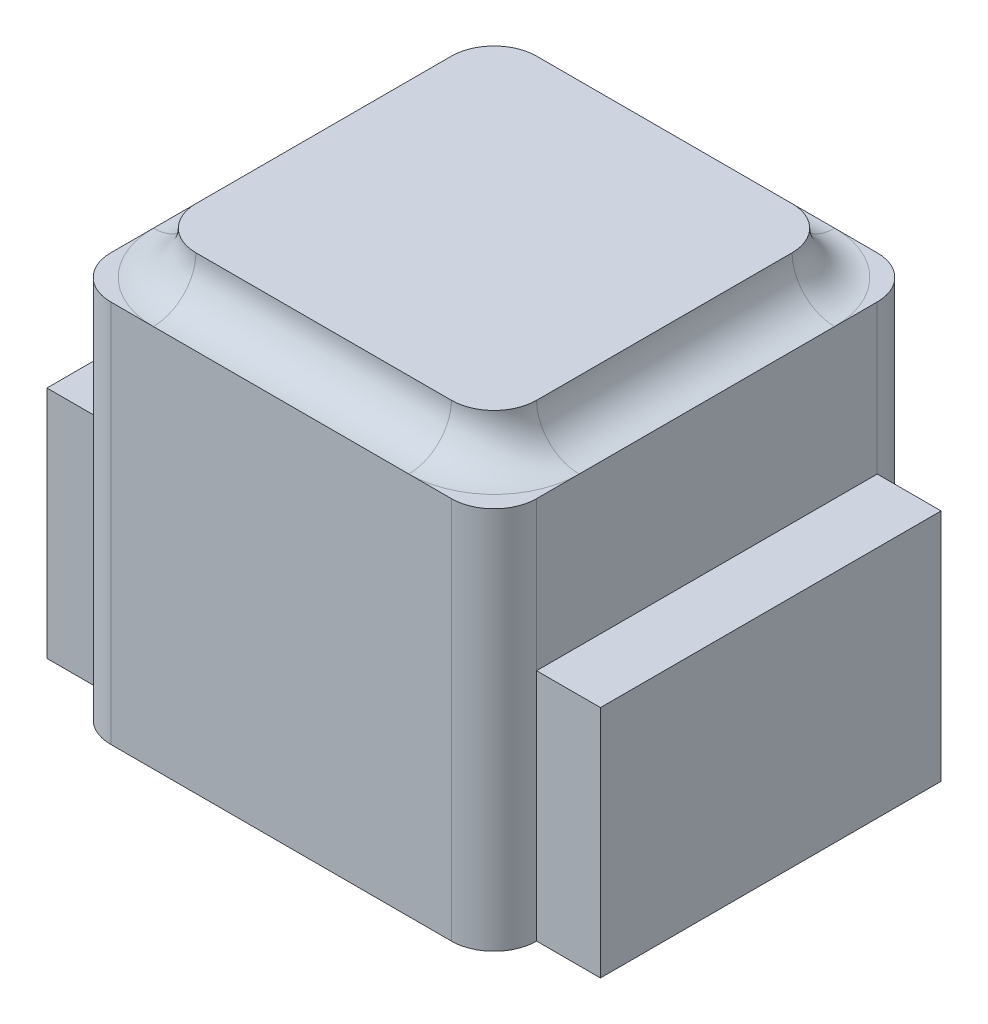
ISO-10303-21;
HEADER;
FILE_DESCRIPTION(('STEP AP214'),'2;1');
FILE_NAME('part.step','',(''),(''),'','','');
FILE_SCHEMA(('AUTOMOTIVE_DESIGN { 1 0 10303 214 1 1 1 1 }'));
ENDSEC;
DATA;
#1=APPLICATION_CONTEXT('core data for automotive mechanical design processes');
#2=APPLICATION_PROTOCOL_DEFINITION('international standard','automotive_design',2000,#1);
#3=PRODUCT_CONTEXT('',#1,'mechanical');
#4=PRODUCT('Part','Part','',(#3));
#5=PRODUCT_RELATED_PRODUCT_CATEGORY('part','',(#4));
#6=PRODUCT_DEFINITION_FORMATION('','',#4);
#7=PRODUCT_DEFINITION_CONTEXT('part definition',#1,'design');
#8=PRODUCT_DEFINITION('design','',#6,#7);
#9=PRODUCT_DEFINITION_SHAPE('','',#8);
#10=(LENGTH_UNIT() NAMED_UNIT(*) SI_UNIT(.MILLI.,.METRE.));
#11=(NAMED_UNIT(*) PLANE_ANGLE_UNIT() SI_UNIT($,.RADIAN.));
#12=(NAMED_UNIT(*) SI_UNIT($,.STERADIAN.) SOLID_ANGLE_UNIT());
#13=UNCERTAINTY_MEASURE_WITH_UNIT(LENGTH_MEASURE(1.E-05),#10,'distance_accuracy_value','');
#14=(GEOMETRIC_REPRESENTATION_CONTEXT(3) GLOBAL_UNCERTAINTY_ASSIGNED_CONTEXT((#13)) GLOBAL_UNIT_ASSIGNED_CONTEXT((#10,
#11,#12)) REPRESENTATION_CONTEXT('',''));
#15=CARTESIAN_POINT('',(0.,0.,0.));
#16=DIRECTION('',(0.,0.,1.));
#17=DIRECTION('',(1.,0.,0.));
#18=AXIS2_PLACEMENT_3D('',#15,#16,#17);
#19=CARTESIAN_POINT('',(0.,9.,0.));
#20=DIRECTION('',(0.,-1.,0.));
#21=DIRECTION('',(0.,0.,-1.));
#22=AXIS2_PLACEMENT_3D('',#19,#20,#21);
#23=PLANE('',#22);
#24=CARTESIAN_POINT('',(3.,9.,3.));
#25=DIRECTION('',(0.,-1.,0.));
#26=DIRECTION('',(0.,0.,-1.));
#27=AXIS2_PLACEMENT_3D('',#24,#25,#26);
#28=CIRCLE('',#27,2.);
#29=CARTESIAN_POINT('',(3.,9.,5.));
#30=VERTEX_POINT('',#29);
#31=CARTESIAN_POINT('',(5.,9.,3.));
#32=VERTEX_POINT('',#31);
#33=EDGE_CURVE('E11',#30,#32,#28,.F.);
#34=ORIENTED_EDGE('',*,*,#33,.F.);
#35=DIRECTION('',(1.,0.,0.));
#36=VECTOR('',#35,1.);
#37=CARTESIAN_POINT('',(5.,9.,5.));
#38=LINE('',#37,#36);
#39=CARTESIAN_POINT('',(3.99999999999999,9.,5.));
#40=VERTEX_POINT('',#39);
#41=EDGE_CURVE('E279',#30,#40,#38,.T.);
#42=ORIENTED_EDGE('',*,*,#41,.T.);
#43=CARTESIAN_POINT('',(4.,9.,4.));
#44=DIRECTION('',(0.,-1.,0.));
#45=DIRECTION('',(0.,0.,-1.));
#46=AXIS2_PLACEMENT_3D('',#43,#44,#45);
#47=CIRCLE('',#46,1.);
#48=CARTESIAN_POINT('',(5.,9.,4.));
#49=VERTEX_POINT('',#48);
#50=EDGE_CURVE('E306',#49,#40,#47,.T.);
#51=ORIENTED_EDGE('',*,*,#50,.F.);
#52=DIRECTION('',(0.,0.,-1.));
#53=VECTOR('',#52,1.);
#54=CARTESIAN_POINT('',(5.,9.,-5.));
#55=LINE('',#54,#53);
#56=EDGE_CURVE('E364',#49,#32,#55,.T.);
#57=ORIENTED_EDGE('',*,*,#56,.T.);
#58=EDGE_LOOP('',(#34,#42,#51,#57));
#59=FACE_BOUND('',#58,.T.);
#60=ADVANCED_FACE('F33',(#59),#23,.F.);
#61=CARTESIAN_POINT('',(-3.,9.,3.));
#62=DIRECTION('',(0.,-1.,0.));
#63=DIRECTION('',(0.,0.,-1.));
#64=AXIS2_PLACEMENT_3D('',#61,#62,#63);
#65=CIRCLE('',#64,2.);
#66=CARTESIAN_POINT('',(-5.,9.,3.));
#67=VERTEX_POINT('',#66);
#68=CARTESIAN_POINT('',(-3.,9.,5.));
#69=VERTEX_POINT('',#68);
#70=EDGE_CURVE('E42',#67,#69,#65,.F.);
#71=ORIENTED_EDGE('',*,*,#70,.F.);
#72=DIRECTION('',(0.,0.,1.));
#73=VECTOR('',#72,1.);
#74=CARTESIAN_POINT('',(-5.,9.,-5.));
#75=LINE('',#74,#73);
#76=CARTESIAN_POINT('',(-5.,9.,4.));
#77=VERTEX_POINT('',#76);
#78=EDGE_CURVE('E261',#67,#77,#75,.T.);
#79=ORIENTED_EDGE('',*,*,#78,.T.);
#80=CARTESIAN_POINT('',(-4.,9.,4.));
#81=DIRECTION('',(0.,-1.,0.));
#82=DIRECTION('',(0.,0.,-1.));
#83=AXIS2_PLACEMENT_3D('',#80,#81,#82);
#84=CIRCLE('',#83,1.);
#85=CARTESIAN_POINT('',(-3.99999999999999,9.,5.));
#86=VERTEX_POINT('',#85);
#87=EDGE_CURVE('E255',#86,#77,#84,.T.);
#88=ORIENTED_EDGE('',*,*,#87,.F.);
#89=EDGE_CURVE('E258',#86,#69,#38,.T.);
#90=ORIENTED_EDGE('',*,*,#89,.T.);
#91=EDGE_LOOP('',(#71,#79,#88,#90));
#92=FACE_BOUND('',#91,.T.);
#93=ADVANCED_FACE('F257',(#92),#23,.F.);
#94=CARTESIAN_POINT('',(-3.,9.,-3.));
#95=DIRECTION('',(0.,-1.,0.));
#96=DIRECTION('',(0.,0.,-1.));
#97=AXIS2_PLACEMENT_3D('',#94,#95,#96);
#98=CIRCLE('',#97,2.);
#99=CARTESIAN_POINT('',(-3.,9.,-5.));
#100=VERTEX_POINT('',#99);
#101=CARTESIAN_POINT('',(-5.,9.,-3.));
#102=VERTEX_POINT('',#101);
#103=EDGE_CURVE('E319',#100,#102,#98,.F.);
#104=ORIENTED_EDGE('',*,*,#103,.F.);
#105=DIRECTION('',(-1.,0.,0.));
#106=VECTOR('',#105,1.);
#107=CARTESIAN_POINT('',(5.,9.,-5.));
#108=LINE('',#107,#106);
#109=CARTESIAN_POINT('',(-4.,9.,-5.));
#110=VERTEX_POINT('',#109);
#111=EDGE_CURVE('E367',#100,#110,#108,.T.);
#112=ORIENTED_EDGE('',*,*,#111,.T.);
#113=CARTESIAN_POINT('',(-4.,9.,-4.));
#114=DIRECTION('',(0.,-1.,0.));
#115=DIRECTION('',(0.,0.,-1.));
#116=AXIS2_PLACEMENT_3D('',#113,#114,#115);
#117=CIRCLE('',#116,1.);
#118=CARTESIAN_POINT('',(-5.,9.,-4.));
#119=VERTEX_POINT('',#118);
#120=EDGE_CURVE('E265',#119,#110,#117,.T.);
#121=ORIENTED_EDGE('',*,*,#120,.F.);
#122=EDGE_CURVE('E360',#119,#102,#75,.T.);
#123=ORIENTED_EDGE('',*,*,#122,.T.);
#124=EDGE_LOOP('',(#104,#112,#121,#123));
#125=FACE_BOUND('',#124,.T.);
#126=ADVANCED_FACE('F612',(#125),#23,.F.);
#127=CARTESIAN_POINT('',(3.,9.,-3.));
#128=DIRECTION('',(0.,-1.,0.));
#129=DIRECTION('',(0.,0.,-1.));
#130=AXIS2_PLACEMENT_3D('',#127,#128,#129);
#131=CIRCLE('',#130,2.);
#132=CARTESIAN_POINT('',(5.,9.,-3.));
#133=VERTEX_POINT('',#132);
#134=CARTESIAN_POINT('',(3.,9.,-5.));
#135=VERTEX_POINT('',#134);
#136=EDGE_CURVE('E50',#133,#135,#131,.F.);
#137=ORIENTED_EDGE('',*,*,#136,.F.);
#138=CARTESIAN_POINT('',(5.,9.,-4.));
#139=VERTEX_POINT('',#138);
#140=EDGE_CURVE('E277',#133,#139,#55,.T.);
#141=ORIENTED_EDGE('',*,*,#140,.T.);
#142=CARTESIAN_POINT('',(4.,9.,-4.));
#143=DIRECTION('',(0.,-1.,0.));
#144=DIRECTION('',(0.,0.,-1.));
#145=AXIS2_PLACEMENT_3D('',#142,#143,#144);
#146=CIRCLE('',#145,1.);
#147=CARTESIAN_POINT('',(3.99999999999999,9.,-5.));
#148=VERTEX_POINT('',#147);
#149=EDGE_CURVE('E373',#148,#139,#146,.T.);
#150=ORIENTED_EDGE('',*,*,#149,.F.);
#151=EDGE_CURVE('E266',#148,#135,#108,.T.);
#152=ORIENTED_EDGE('',*,*,#151,.T.);
#153=EDGE_LOOP('',(#137,#141,#150,#152));
#154=FACE_BOUND('',#153,.T.);
#155=ADVANCED_FACE('F582',(#154),#23,.F.);
#156=CARTESIAN_POINT('',(3.5,8.,-3.5));
#157=DIRECTION('',(1.,0.,0.));
#158=DIRECTION('',(0.,0.,-1.));
#159=AXIS2_PLACEMENT_3D('',#156,#157,#158);
#160=PLANE('',#159);
#161=DIRECTION('',(0.,-1.,0.));
#162=VECTOR('',#161,1.);
#163=CARTESIAN_POINT('',(3.5,0.,0.5));
#164=LINE('',#163,#162);
#165=CARTESIAN_POINT('',(3.5,2.,0.5));
#166=VERTEX_POINT('',#165);
#167=CARTESIAN_POINT('',(3.5,0.,0.499999999999999));
#168=VERTEX_POINT('',#167);
#169=EDGE_CURVE('E377',#166,#168,#164,.T.);
#170=ORIENTED_EDGE('',*,*,#169,.T.);
#171=DIRECTION('',(0.,0.,1.));
#172=VECTOR('',#171,1.);
#173=CARTESIAN_POINT('',(3.5,0.,-3.5));
#174=LINE('',#173,#172);
#175=CARTESIAN_POINT('',(3.5,0.,3.5));
#176=VERTEX_POINT('',#175);
#177=EDGE_CURVE('E421',#168,#176,#174,.T.);
#178=ORIENTED_EDGE('',*,*,#177,.T.);
#179=DIRECTION('',(0.,-1.,0.));
#180=VECTOR('',#179,1.);
#181=CARTESIAN_POINT('',(3.5,8.,3.5));
#182=LINE('',#181,#180);
#183=CARTESIAN_POINT('',(3.5,8.,3.5));
#184=VERTEX_POINT('',#183);
#185=EDGE_CURVE('E438',#184,#176,#182,.T.);
#186=ORIENTED_EDGE('',*,*,#185,.F.);
#187=DIRECTION('',(0.,0.,1.));
#188=VECTOR('',#187,1.);
#189=CARTESIAN_POINT('',(3.5,8.,-3.5));
#190=LINE('',#189,#188);
#191=CARTESIAN_POINT('',(3.5,8.,-3.5));
#192=VERTEX_POINT('',#191);
#193=EDGE_CURVE('E425',#192,#184,#190,.T.);
#194=ORIENTED_EDGE('',*,*,#193,.F.);
#195=DIRECTION('',(0.,-1.,0.));
#196=VECTOR('',#195,1.);
#197=CARTESIAN_POINT('',(3.5,8.,-3.5));
#198=LINE('',#197,#196);
#199=CARTESIAN_POINT('',(3.5,0.,-3.5));
#200=VERTEX_POINT('',#199);
#201=EDGE_CURVE('E449',#192,#200,#198,.T.);
#202=ORIENTED_EDGE('',*,*,#201,.T.);
#203=CARTESIAN_POINT('',(3.5,0.,-0.5));
#204=VERTEX_POINT('',#203);
#205=EDGE_CURVE('E439',#200,#204,#174,.T.);
#206=ORIENTED_EDGE('',*,*,#205,.T.);
#207=DIRECTION('',(0.,1.,0.));
#208=VECTOR('',#207,1.);
#209=CARTESIAN_POINT('',(3.5,0.,-0.5));
#210=LINE('',#209,#208);
#211=CARTESIAN_POINT('',(3.5,2.,-0.499999999999999));
#212=VERTEX_POINT('',#211);
#213=EDGE_CURVE('E379',#204,#212,#210,.T.);
#214=ORIENTED_EDGE('',*,*,#213,.T.);
#215=DIRECTION('',(0.,0.,1.));
#216=VECTOR('',#215,1.);
#217=CARTESIAN_POINT('',(3.5,2.,-0.499999999999999));
#218=LINE('',#217,#216);
#219=EDGE_CURVE('E382',#212,#166,#218,.T.);
#220=ORIENTED_EDGE('',*,*,#219,.T.);
#221=EDGE_LOOP('',(#170,#178,#186,#194,#202,#206,#214,#220));
#222=FACE_BOUND('',#221,.T.);
#223=ADVANCED_FACE('F619',(#222),#160,.F.);
#224=CARTESIAN_POINT('',(-3.5,8.,-3.5));
#225=DIRECTION('',(-1.,0.,0.));
#226=DIRECTION('',(0.,0.,1.));
#227=AXIS2_PLACEMENT_3D('',#224,#225,#226);
#228=PLANE('',#227);
#229=DIRECTION('',(0.,-1.,0.));
#230=VECTOR('',#229,1.);
#231=CARTESIAN_POINT('',(-3.5,0.,0.5));
#232=LINE('',#231,#230);
#233=CARTESIAN_POINT('',(-3.5,2.,0.5));
#234=VERTEX_POINT('',#233);
#235=CARTESIAN_POINT('',(-3.5,0.,0.499999999999999));
#236=VERTEX_POINT('',#235);
#237=EDGE_CURVE('E376',#234,#236,#232,.T.);
#238=ORIENTED_EDGE('',*,*,#237,.F.);
#239=DIRECTION('',(0.,0.,1.));
#240=VECTOR('',#239,1.);
#241=CARTESIAN_POINT('',(-3.5,2.,-0.499999999999999));
#242=LINE('',#241,#240);
#243=CARTESIAN_POINT('',(-3.5,2.,-0.499999999999999));
#244=VERTEX_POINT('',#243);
#245=EDGE_CURVE('E380',#244,#234,#242,.T.);
#246=ORIENTED_EDGE('',*,*,#245,.F.);
#247=DIRECTION('',(0.,1.,0.));
#248=VECTOR('',#247,1.);
#249=CARTESIAN_POINT('',(-3.5,0.,-0.5));
#250=LINE('',#249,#248);
#251=CARTESIAN_POINT('',(-3.5,0.,-0.5));
#252=VERTEX_POINT('',#251);
#253=EDGE_CURVE('E387',#252,#244,#250,.T.);
#254=ORIENTED_EDGE('',*,*,#253,.F.);
#255=DIRECTION('',(0.,0.,-1.));
#256=VECTOR('',#255,1.);
#257=CARTESIAN_POINT('',(-3.5,0.,-3.5));
#258=LINE('',#257,#256);
#259=CARTESIAN_POINT('',(-3.5,0.,-3.5));
#260=VERTEX_POINT('',#259);
#261=EDGE_CURVE('E444',#252,#260,#258,.T.);
#262=ORIENTED_EDGE('',*,*,#261,.T.);
#263=DIRECTION('',(0.,-1.,0.));
#264=VECTOR('',#263,1.);
#265=CARTESIAN_POINT('',(-3.5,8.,-3.5));
#266=LINE('',#265,#264);
#267=CARTESIAN_POINT('',(-3.5,8.,-3.5));
#268=VERTEX_POINT('',#267);
#269=EDGE_CURVE('E452',#268,#260,#266,.T.);
#270=ORIENTED_EDGE('',*,*,#269,.F.);
#271=DIRECTION('',(0.,0.,-1.));
#272=VECTOR('',#271,1.);
#273=CARTESIAN_POINT('',(-3.5,8.,-3.5));
#274=LINE('',#273,#272);
#275=CARTESIAN_POINT('',(-3.5,8.,3.5));
#276=VERTEX_POINT('',#275);
#277=EDGE_CURVE('E432',#276,#268,#274,.T.);
#278=ORIENTED_EDGE('',*,*,#277,.F.);
#279=DIRECTION('',(0.,-1.,0.));
#280=VECTOR('',#279,1.);
#281=CARTESIAN_POINT('',(-3.5,8.,3.5));
#282=LINE('',#281,#280);
#283=CARTESIAN_POINT('',(-3.5,0.,3.5));
#284=VERTEX_POINT('',#283);
#285=EDGE_CURVE('E455',#276,#284,#282,.T.);
#286=ORIENTED_EDGE('',*,*,#285,.T.);
#287=EDGE_CURVE('E445',#284,#236,#258,.T.);
#288=ORIENTED_EDGE('',*,*,#287,.T.);
#289=EDGE_LOOP('',(#238,#246,#254,#262,#270,#278,#286,#288));
#290=FACE_BOUND('',#289,.T.);
#291=ADVANCED_FACE('F771',(#290),#228,.F.);
#292=CARTESIAN_POINT('',(0.,8.,0.));
#293=DIRECTION('',(0.,-1.,0.));
#294=DIRECTION('',(0.,0.,-1.));
#295=AXIS2_PLACEMENT_3D('',#292,#293,#294);
#296=CYLINDRICAL_SURFACE('',#295,1.75);
#297=CARTESIAN_POINT('',(0.,8.,0.));
#298=DIRECTION('',(0.,-1.,0.));
#299=DIRECTION('',(0.,0.,-1.));
#300=AXIS2_PLACEMENT_3D('',#297,#298,#299);
#301=CIRCLE('',#300,1.75);
#302=CARTESIAN_POINT('',(0.,8.,-1.75));
#303=VERTEX_POINT('',#302);
#304=EDGE_CURVE('E418',#303,#303,#301,.T.);
#305=ORIENTED_EDGE('',*,*,#304,.T.);
#306=EDGE_LOOP('',(#305));
#307=FACE_BOUND('',#306,.T.);
#308=CARTESIAN_POINT('',(0.,2.,0.));
#309=DIRECTION('',(0.,-1.,0.));
#310=DIRECTION('',(0.,0.,-1.));
#311=AXIS2_PLACEMENT_3D('',#308,#309,#310);
#312=CIRCLE('',#311,1.75);
#313=CARTESIAN_POINT('',(-1.67705098312484,2.,-0.499999999999999));
#314=VERTEX_POINT('',#313);
#315=CARTESIAN_POINT('',(-1.67705098312484,2.,0.5));
#316=VERTEX_POINT('',#315);
#317=EDGE_CURVE('E305',#314,#316,#312,.F.);
#318=ORIENTED_EDGE('',*,*,#317,.T.);
#319=DIRECTION('',(0.,-1.,0.));
#320=VECTOR('',#319,1.);
#321=CARTESIAN_POINT('',(-1.67705098312484,8.,0.5));
#322=LINE('',#321,#320);
#323=CARTESIAN_POINT('',(-1.67705098312484,0.,0.5));
#324=VERTEX_POINT('',#323);
#325=EDGE_CURVE('E411',#316,#324,#322,.T.);
#326=ORIENTED_EDGE('',*,*,#325,.T.);
#327=CARTESIAN_POINT('',(0.,0.,0.));
#328=DIRECTION('',(0.,-1.,0.));
#329=DIRECTION('',(0.,0.,-1.));
#330=AXIS2_PLACEMENT_3D('',#327,#328,#329);
#331=CIRCLE('',#330,1.75);
#332=CARTESIAN_POINT('',(1.67705098312484,0.,0.5));
#333=VERTEX_POINT('',#332);
#334=EDGE_CURVE('E422',#333,#324,#331,.T.);
#335=ORIENTED_EDGE('',*,*,#334,.F.);
#336=DIRECTION('',(0.,-1.,0.));
#337=VECTOR('',#336,1.);
#338=CARTESIAN_POINT('',(1.67705098312484,8.,0.5));
#339=LINE('',#338,#337);
#340=CARTESIAN_POINT('',(1.67705098312484,2.,0.5));
#341=VERTEX_POINT('',#340);
#342=EDGE_CURVE('E414',#333,#341,#339,.F.);
#343=ORIENTED_EDGE('',*,*,#342,.T.);
#344=CARTESIAN_POINT('',(1.67705098312484,2.,-0.499999999999999));
#345=VERTEX_POINT('',#344);
#346=EDGE_CURVE('E302',#341,#345,#312,.F.);
#347=ORIENTED_EDGE('',*,*,#346,.T.);
#348=DIRECTION('',(0.,-1.,0.));
#349=VECTOR('',#348,1.);
#350=CARTESIAN_POINT('',(1.67705098312484,8.,-0.499999999999995));
#351=LINE('',#350,#349);
#352=CARTESIAN_POINT('',(1.67705098312484,0.,-0.5));
#353=VERTEX_POINT('',#352);
#354=EDGE_CURVE('E405',#345,#353,#351,.T.);
#355=ORIENTED_EDGE('',*,*,#354,.T.);
#356=CARTESIAN_POINT('',(-1.67705098312484,0.,-0.5));
#357=VERTEX_POINT('',#356);
#358=EDGE_CURVE('E417',#357,#353,#331,.T.);
#359=ORIENTED_EDGE('',*,*,#358,.F.);
#360=DIRECTION('',(0.,-1.,0.));
#361=VECTOR('',#360,1.);
#362=CARTESIAN_POINT('',(-1.67705098312484,8.,-0.499999999999995));
#363=LINE('',#362,#361);
#364=EDGE_CURVE('E408',#357,#314,#363,.F.);
#365=ORIENTED_EDGE('',*,*,#364,.T.);
#366=EDGE_LOOP('',(#318,#326,#335,#343,#347,#355,#359,#365));
#367=FACE_BOUND('',#366,.T.);
#368=ADVANCED_FACE('F652',(#307,#367),#296,.T.);
#369=CARTESIAN_POINT('',(-5.,10.,3.99999999999999));
#370=DIRECTION('',(1.,0.,0.));
#371=DIRECTION('',(0.,0.,-1.));
#372=AXIS2_PLACEMENT_3D('',#369,#370,#371);
#373=PLANE('',#372);
#374=DIRECTION('',(0.,-1.,0.));
#375=VECTOR('',#374,1.);
#376=CARTESIAN_POINT('',(-5.,10.,3.99999999999999));
#377=LINE('',#376,#375);
#378=CARTESIAN_POINT('',(-5.,5.5,4.));
#379=VERTEX_POINT('',#378);
#380=EDGE_CURVE('E285',#77,#379,#377,.T.);
#381=ORIENTED_EDGE('',*,*,#380,.F.);
#382=ORIENTED_EDGE('',*,*,#78,.F.);
#383=EDGE_CURVE('E362',#102,#67,#75,.T.);
#384=ORIENTED_EDGE('',*,*,#383,.F.);
#385=ORIENTED_EDGE('',*,*,#122,.F.);
#386=DIRECTION('',(0.,-1.,0.));
#387=VECTOR('',#386,1.);
#388=CARTESIAN_POINT('',(-5.,10.,-3.99999999999999));
#389=LINE('',#388,#387);
#390=CARTESIAN_POINT('',(-5.,5.5,-4.));
#391=VERTEX_POINT('',#390);
#392=EDGE_CURVE('E288',#119,#391,#389,.T.);
#393=ORIENTED_EDGE('',*,*,#392,.T.);
#394=DIRECTION('',(0.,0.,-1.));
#395=VECTOR('',#394,1.);
#396=CARTESIAN_POINT('',(-5.,5.5,3.99999999999999));
#397=LINE('',#396,#395);
#398=EDGE_CURVE('E506',#379,#391,#397,.T.);
#399=ORIENTED_EDGE('',*,*,#398,.F.);
#400=EDGE_LOOP('',(#381,#382,#384,#385,#393,#399));
#401=FACE_BOUND('',#400,.T.);
#402=ADVANCED_FACE('F590',(#401),#373,.F.);
#403=CARTESIAN_POINT('',(5.,10.,3.99999999999999));
#404=DIRECTION('',(-1.,0.,0.));
#405=DIRECTION('',(0.,0.,1.));
#406=AXIS2_PLACEMENT_3D('',#403,#404,#405);
#407=PLANE('',#406);
#408=DIRECTION('',(0.,-1.,0.));
#409=VECTOR('',#408,1.);
#410=CARTESIAN_POINT('',(5.,10.,-3.99999999999999));
#411=LINE('',#410,#409);
#412=CARTESIAN_POINT('',(5.,5.5,-3.99999999999999));
#413=VERTEX_POINT('',#412);
#414=EDGE_CURVE('E523',#139,#413,#411,.T.);
#415=ORIENTED_EDGE('',*,*,#414,.F.);
#416=ORIENTED_EDGE('',*,*,#140,.F.);
#417=EDGE_CURVE('E368',#32,#133,#55,.T.);
#418=ORIENTED_EDGE('',*,*,#417,.F.);
#419=ORIENTED_EDGE('',*,*,#56,.F.);
#420=DIRECTION('',(0.,-1.,0.));
#421=VECTOR('',#420,1.);
#422=CARTESIAN_POINT('',(5.,10.,3.99999999999999));
#423=LINE('',#422,#421);
#424=CARTESIAN_POINT('',(5.,5.5,3.99999999999999));
#425=VERTEX_POINT('',#424);
#426=EDGE_CURVE('E290',#49,#425,#423,.T.);
#427=ORIENTED_EDGE('',*,*,#426,.T.);
#428=DIRECTION('',(0.,0.,1.));
#429=VECTOR('',#428,1.);
#430=CARTESIAN_POINT('',(5.,5.5,3.99999999999999));
#431=LINE('',#430,#429);
#432=EDGE_CURVE('E299',#413,#425,#431,.T.);
#433=ORIENTED_EDGE('',*,*,#432,.F.);
#434=EDGE_LOOP('',(#415,#416,#418,#419,#427,#433));
#435=FACE_BOUND('',#434,.T.);
#436=ADVANCED_FACE('F530',(#435),#407,.F.);
#437=CARTESIAN_POINT('',(4.,10.,-4.));
#438=DIRECTION('',(0.,-1.,0.));
#439=DIRECTION('',(0.,0.,-1.));
#440=AXIS2_PLACEMENT_3D('',#437,#438,#439);
#441=CYLINDRICAL_SURFACE('',#440,1.);
#442=DIRECTION('',(0.,-1.,0.));
#443=VECTOR('',#442,1.);
#444=CARTESIAN_POINT('',(3.99999999999999,10.,-5.));
#445=LINE('',#444,#443);
#446=CARTESIAN_POINT('',(3.99999999999999,0.,-5.));
#447=VERTEX_POINT('',#446);
#448=EDGE_CURVE('E297',#148,#447,#445,.T.);
#449=ORIENTED_EDGE('',*,*,#448,.F.);
#450=ORIENTED_EDGE('',*,*,#149,.T.);
#451=ORIENTED_EDGE('',*,*,#414,.T.);
#452=DIRECTION('',(0.,1.,0.));
#453=VECTOR('',#452,1.);
#454=CARTESIAN_POINT('',(5.,10.,-4.));
#455=LINE('',#454,#453);
#456=CARTESIAN_POINT('',(5.,0.,-4.));
#457=VERTEX_POINT('',#456);
#458=EDGE_CURVE('E501',#457,#413,#455,.T.);
#459=ORIENTED_EDGE('',*,*,#458,.F.);
#460=CARTESIAN_POINT('',(4.,0.,-4.));
#461=DIRECTION('',(0.,1.,0.));
#462=DIRECTION('',(0.,0.,-1.));
#463=AXIS2_PLACEMENT_3D('',#460,#461,#462);
#464=CIRCLE('',#463,1.);
#465=EDGE_CURVE('E509',#457,#447,#464,.T.);
#466=ORIENTED_EDGE('',*,*,#465,.T.);
#467=EDGE_LOOP('',(#449,#450,#451,#459,#466));
#468=FACE_BOUND('',#467,.T.);
#469=ADVANCED_FACE('F552',(#468),#441,.T.);
#470=CARTESIAN_POINT('',(-3.99999999999999,10.,-5.));
#471=DIRECTION('',(0.,0.,1.));
#472=DIRECTION('',(1.,0.,0.));
#473=AXIS2_PLACEMENT_3D('',#470,#471,#472);
#474=PLANE('',#473);
#475=DIRECTION('',(0.,-1.,0.));
#476=VECTOR('',#475,1.);
#477=CARTESIAN_POINT('',(-3.99999999999999,10.,-5.));
#478=LINE('',#477,#476);
#479=CARTESIAN_POINT('',(-3.99999999999999,0.,-5.));
#480=VERTEX_POINT('',#479);
#481=EDGE_CURVE('E295',#110,#480,#478,.T.);
#482=ORIENTED_EDGE('',*,*,#481,.F.);
#483=ORIENTED_EDGE('',*,*,#111,.F.);
#484=EDGE_CURVE('E369',#135,#100,#108,.T.);
#485=ORIENTED_EDGE('',*,*,#484,.F.);
#486=ORIENTED_EDGE('',*,*,#151,.F.);
#487=ORIENTED_EDGE('',*,*,#448,.T.);
#488=DIRECTION('',(-1.,0.,0.));
#489=VECTOR('',#488,1.);
#490=CARTESIAN_POINT('',(-3.99999999999999,0.,-5.));
#491=LINE('',#490,#489);
#492=EDGE_CURVE('E512',#447,#480,#491,.T.);
#493=ORIENTED_EDGE('',*,*,#492,.T.);
#494=EDGE_LOOP('',(#482,#483,#485,#486,#487,#493));
#495=FACE_BOUND('',#494,.T.);
#496=ADVANCED_FACE('F578',(#495),#474,.F.);
#497=CARTESIAN_POINT('',(-4.,10.,-4.));
#498=DIRECTION('',(0.,-1.,0.));
#499=DIRECTION('',(0.,0.,-1.));
#500=AXIS2_PLACEMENT_3D('',#497,#498,#499);
#501=CYLINDRICAL_SURFACE('',#500,1.);
#502=ORIENTED_EDGE('',*,*,#392,.F.);
#503=ORIENTED_EDGE('',*,*,#120,.T.);
#504=ORIENTED_EDGE('',*,*,#481,.T.);
#505=CARTESIAN_POINT('',(-4.,0.,-4.));
#506=DIRECTION('',(0.,1.,0.));
#507=DIRECTION('',(0.,0.,-1.));
#508=AXIS2_PLACEMENT_3D('',#505,#506,#507);
#509=CIRCLE('',#508,1.);
#510=CARTESIAN_POINT('',(-5.,0.,-4.));
#511=VERTEX_POINT('',#510);
#512=EDGE_CURVE('E515',#480,#511,#509,.T.);
#513=ORIENTED_EDGE('',*,*,#512,.T.);
#514=DIRECTION('',(0.,-1.,0.));
#515=VECTOR('',#514,1.);
#516=CARTESIAN_POINT('',(-5.,10.,-4.));
#517=LINE('',#516,#515);
#518=EDGE_CURVE('E504',#391,#511,#517,.T.);
#519=ORIENTED_EDGE('',*,*,#518,.F.);
#520=EDGE_LOOP('',(#502,#503,#504,#513,#519));
#521=FACE_BOUND('',#520,.T.);
#522=ADVANCED_FACE('F610',(#521),#501,.T.);
#523=CARTESIAN_POINT('',(-4.,10.,4.));
#524=DIRECTION('',(0.,-1.,0.));
#525=DIRECTION('',(0.,0.,-1.));
#526=AXIS2_PLACEMENT_3D('',#523,#524,#525);
#527=CYLINDRICAL_SURFACE('',#526,1.);
#528=DIRECTION('',(0.,-1.,0.));
#529=VECTOR('',#528,1.);
#530=CARTESIAN_POINT('',(-3.99999999999999,10.,5.));
#531=LINE('',#530,#529);
#532=CARTESIAN_POINT('',(-3.99999999999999,0.,5.));
#533=VERTEX_POINT('',#532);
#534=EDGE_CURVE('E272',#86,#533,#531,.T.);
#535=ORIENTED_EDGE('',*,*,#534,.F.);
#536=ORIENTED_EDGE('',*,*,#87,.T.);
#537=ORIENTED_EDGE('',*,*,#380,.T.);
#538=DIRECTION('',(0.,-1.,0.));
#539=VECTOR('',#538,1.);
#540=CARTESIAN_POINT('',(-5.,10.,4.));
#541=LINE('',#540,#539);
#542=CARTESIAN_POINT('',(-5.,0.,3.99999999999999));
#543=VERTEX_POINT('',#542);
#544=EDGE_CURVE('E498',#543,#379,#541,.F.);
#545=ORIENTED_EDGE('',*,*,#544,.F.);
#546=CARTESIAN_POINT('',(-4.,0.,4.));
#547=DIRECTION('',(0.,1.,0.));
#548=DIRECTION('',(0.,0.,-1.));
#549=AXIS2_PLACEMENT_3D('',#546,#547,#548);
#550=CIRCLE('',#549,1.);
#551=EDGE_CURVE('E283',#543,#533,#550,.T.);
#552=ORIENTED_EDGE('',*,*,#551,.T.);
#553=EDGE_LOOP('',(#535,#536,#537,#545,#552));
#554=FACE_BOUND('',#553,.T.);
#555=ADVANCED_FACE('F280',(#554),#527,.T.);
#556=CARTESIAN_POINT('',(-3.99999999999999,10.,5.));
#557=DIRECTION('',(0.,0.,-1.));
#558=DIRECTION('',(-1.,0.,0.));
#559=AXIS2_PLACEMENT_3D('',#556,#557,#558);
#560=PLANE('',#559);
#561=DIRECTION('',(0.,-1.,0.));
#562=VECTOR('',#561,1.);
#563=CARTESIAN_POINT('',(3.99999999999999,10.,5.));
#564=LINE('',#563,#562);
#565=CARTESIAN_POINT('',(3.99999999999999,0.,5.));
#566=VERTEX_POINT('',#565);
#567=EDGE_CURVE('E286',#40,#566,#564,.T.);
#568=ORIENTED_EDGE('',*,*,#567,.F.);
#569=ORIENTED_EDGE('',*,*,#41,.F.);
#570=EDGE_CURVE('E276',#69,#30,#38,.T.);
#571=ORIENTED_EDGE('',*,*,#570,.F.);
#572=ORIENTED_EDGE('',*,*,#89,.F.);
#573=ORIENTED_EDGE('',*,*,#534,.T.);
#574=DIRECTION('',(1.,0.,0.));
#575=VECTOR('',#574,1.);
#576=CARTESIAN_POINT('',(-3.99999999999999,0.,5.));
#577=LINE('',#576,#575);
#578=EDGE_CURVE('E519',#533,#566,#577,.T.);
#579=ORIENTED_EDGE('',*,*,#578,.T.);
#580=EDGE_LOOP('',(#568,#569,#571,#572,#573,#579));
#581=FACE_BOUND('',#580,.T.);
#582=ADVANCED_FACE('F270',(#581),#560,.F.);
#583=CARTESIAN_POINT('',(4.,10.,4.));
#584=DIRECTION('',(0.,-1.,0.));
#585=DIRECTION('',(0.,0.,-1.));
#586=AXIS2_PLACEMENT_3D('',#583,#584,#585);
#587=CYLINDRICAL_SURFACE('',#586,1.);
#588=ORIENTED_EDGE('',*,*,#426,.F.);
#589=ORIENTED_EDGE('',*,*,#50,.T.);
#590=ORIENTED_EDGE('',*,*,#567,.T.);
#591=CARTESIAN_POINT('',(4.,0.,4.));
#592=DIRECTION('',(0.,1.,0.));
#593=DIRECTION('',(0.,0.,1.));
#594=AXIS2_PLACEMENT_3D('',#591,#592,#593);
#595=CIRCLE('',#594,1.);
#596=CARTESIAN_POINT('',(5.,0.,3.99999999999999));
#597=VERTEX_POINT('',#596);
#598=EDGE_CURVE('E521',#566,#597,#595,.T.);
#599=ORIENTED_EDGE('',*,*,#598,.T.);
#600=DIRECTION('',(0.,-1.,0.));
#601=VECTOR('',#600,1.);
#602=CARTESIAN_POINT('',(5.,10.,3.99999999999999));
#603=LINE('',#602,#601);
#604=EDGE_CURVE('E495',#425,#597,#603,.T.);
#605=ORIENTED_EDGE('',*,*,#604,.F.);
#606=EDGE_LOOP('',(#588,#589,#590,#599,#605));
#607=FACE_BOUND('',#606,.T.);
#608=ADVANCED_FACE('F533',(#607),#587,.T.);
#609=CARTESIAN_POINT('',(4.,0.,-4.));
#610=DIRECTION('',(0.,-1.,0.));
#611=DIRECTION('',(0.,0.,-1.));
#612=AXIS2_PLACEMENT_3D('',#609,#610,#611);
#613=PLANE('',#612);
#614=DIRECTION('',(-1.,0.,0.));
#615=VECTOR('',#614,1.);
#616=CARTESIAN_POINT('',(3.5,0.,-0.5));
#617=LINE('',#616,#615);
#618=EDGE_CURVE('E399',#204,#353,#617,.T.);
#619=ORIENTED_EDGE('',*,*,#618,.F.);
#620=ORIENTED_EDGE('',*,*,#205,.F.);
#621=DIRECTION('',(1.,0.,0.));
#622=VECTOR('',#621,1.);
#623=CARTESIAN_POINT('',(-3.5,0.,-3.5));
#624=LINE('',#623,#622);
#625=EDGE_CURVE('E429',#260,#200,#624,.T.);
#626=ORIENTED_EDGE('',*,*,#625,.F.);
#627=ORIENTED_EDGE('',*,*,#261,.F.);
#628=EDGE_CURVE('E398',#357,#252,#617,.T.);
#629=ORIENTED_EDGE('',*,*,#628,.F.);
#630=ORIENTED_EDGE('',*,*,#358,.T.);
#631=EDGE_LOOP('',(#619,#620,#626,#627,#629,#630));
#632=FACE_BOUND('',#631,.T.);
#633=ORIENTED_EDGE('',*,*,#177,.F.);
#634=DIRECTION('',(-1.,0.,0.));
#635=VECTOR('',#634,1.);
#636=CARTESIAN_POINT('',(3.5,0.,0.5));
#637=LINE('',#636,#635);
#638=EDGE_CURVE('E402',#168,#333,#637,.T.);
#639=ORIENTED_EDGE('',*,*,#638,.T.);
#640=ORIENTED_EDGE('',*,*,#334,.T.);
#641=EDGE_CURVE('E401',#324,#236,#637,.T.);
#642=ORIENTED_EDGE('',*,*,#641,.T.);
#643=ORIENTED_EDGE('',*,*,#287,.F.);
#644=DIRECTION('',(-1.,0.,0.));
#645=VECTOR('',#644,1.);
#646=CARTESIAN_POINT('',(-3.5,0.,3.5));
#647=LINE('',#646,#645);
#648=EDGE_CURVE('E441',#176,#284,#647,.T.);
#649=ORIENTED_EDGE('',*,*,#648,.F.);
#650=EDGE_LOOP('',(#633,#639,#640,#642,#643,#649));
#651=FACE_BOUND('',#650,.T.);
#652=ORIENTED_EDGE('',*,*,#551,.F.);
#653=DIRECTION('',(1.,0.,0.));
#654=VECTOR('',#653,1.);
#655=CARTESIAN_POINT('',(-6.5,0.,4.));
#656=LINE('',#655,#654);
#657=CARTESIAN_POINT('',(-6.5,0.,4.));
#658=VERTEX_POINT('',#657);
#659=EDGE_CURVE('E463',#658,#543,#656,.T.);
#660=ORIENTED_EDGE('',*,*,#659,.F.);
#661=DIRECTION('',(0.,0.,1.));
#662=VECTOR('',#661,1.);
#663=CARTESIAN_POINT('',(-6.5,0.,4.));
#664=LINE('',#663,#662);
#665=CARTESIAN_POINT('',(-6.5,0.,-4.));
#666=VERTEX_POINT('',#665);
#667=EDGE_CURVE('E480',#666,#658,#664,.T.);
#668=ORIENTED_EDGE('',*,*,#667,.F.);
#669=DIRECTION('',(-1.,0.,0.));
#670=VECTOR('',#669,1.);
#671=CARTESIAN_POINT('',(-6.5,0.,-4.));
#672=LINE('',#671,#670);
#673=EDGE_CURVE('E476',#511,#666,#672,.T.);
#674=ORIENTED_EDGE('',*,*,#673,.F.);
#675=ORIENTED_EDGE('',*,*,#512,.F.);
#676=ORIENTED_EDGE('',*,*,#492,.F.);
#677=ORIENTED_EDGE('',*,*,#465,.F.);
#678=CARTESIAN_POINT('',(6.5,0.,-4.));
#679=VERTEX_POINT('',#678);
#680=EDGE_CURVE('E477',#679,#457,#672,.T.);
#681=ORIENTED_EDGE('',*,*,#680,.F.);
#682=DIRECTION('',(0.,0.,-1.));
#683=VECTOR('',#682,1.);
#684=CARTESIAN_POINT('',(6.5,0.,4.));
#685=LINE('',#684,#683);
#686=CARTESIAN_POINT('',(6.5,0.,4.));
#687=VERTEX_POINT('',#686);
#688=EDGE_CURVE('E451',#687,#679,#685,.T.);
#689=ORIENTED_EDGE('',*,*,#688,.F.);
#690=EDGE_CURVE('E482',#597,#687,#656,.T.);
#691=ORIENTED_EDGE('',*,*,#690,.F.);
#692=ORIENTED_EDGE('',*,*,#598,.F.);
#693=ORIENTED_EDGE('',*,*,#578,.F.);
#694=EDGE_LOOP('',(#652,#660,#668,#674,#675,#676,#677,#681,#689,#691,#692,#693));
#695=FACE_BOUND('',#694,.T.);
#696=ADVANCED_FACE('F572',(#632,#651,#695),#613,.T.);
#697=CARTESIAN_POINT('',(6.5,5.5,4.));
#698=DIRECTION('',(-1.,0.,0.));
#699=DIRECTION('',(0.,0.,1.));
#700=AXIS2_PLACEMENT_3D('',#697,#698,#699);
#701=PLANE('',#700);
#702=ORIENTED_EDGE('',*,*,#688,.T.);
#703=DIRECTION('',(0.,-1.,0.));
#704=VECTOR('',#703,1.);
#705=CARTESIAN_POINT('',(6.5,5.5,-4.));
#706=LINE('',#705,#704);
#707=CARTESIAN_POINT('',(6.5,5.5,-4.));
#708=VERTEX_POINT('',#707);
#709=EDGE_CURVE('E492',#708,#679,#706,.T.);
#710=ORIENTED_EDGE('',*,*,#709,.F.);
#711=DIRECTION('',(0.,0.,-1.));
#712=VECTOR('',#711,1.);
#713=CARTESIAN_POINT('',(6.5,5.5,4.));
#714=LINE('',#713,#712);
#715=CARTESIAN_POINT('',(6.5,5.5,4.));
#716=VERTEX_POINT('',#715);
#717=EDGE_CURVE('E459',#716,#708,#714,.T.);
#718=ORIENTED_EDGE('',*,*,#717,.F.);
#719=DIRECTION('',(0.,-1.,0.));
#720=VECTOR('',#719,1.);
#721=CARTESIAN_POINT('',(6.5,5.5,4.));
#722=LINE('',#721,#720);
#723=EDGE_CURVE('E473',#716,#687,#722,.T.);
#724=ORIENTED_EDGE('',*,*,#723,.T.);
#725=EDGE_LOOP('',(#702,#710,#718,#724));
#726=FACE_BOUND('',#725,.T.);
#727=ADVANCED_FACE('F546',(#726),#701,.F.);
#728=CARTESIAN_POINT('',(0.,5.5,0.));
#729=DIRECTION('',(0.,-1.,0.));
#730=DIRECTION('',(0.,0.,-1.));
#731=AXIS2_PLACEMENT_3D('',#728,#729,#730);
#732=PLANE('',#731);
#733=DIRECTION('',(-1.,0.,0.));
#734=VECTOR('',#733,1.);
#735=CARTESIAN_POINT('',(-6.5,5.5,-4.));
#736=LINE('',#735,#734);
#737=EDGE_CURVE('E464',#708,#413,#736,.T.);
#738=ORIENTED_EDGE('',*,*,#737,.T.);
#739=ORIENTED_EDGE('',*,*,#432,.T.);
#740=DIRECTION('',(1.,0.,0.));
#741=VECTOR('',#740,1.);
#742=CARTESIAN_POINT('',(-6.5,5.5,4.));
#743=LINE('',#742,#741);
#744=EDGE_CURVE('E469',#425,#716,#743,.T.);
#745=ORIENTED_EDGE('',*,*,#744,.T.);
#746=ORIENTED_EDGE('',*,*,#717,.T.);
#747=EDGE_LOOP('',(#738,#739,#745,#746));
#748=FACE_BOUND('',#747,.T.);
#749=ADVANCED_FACE('F539',(#748),#732,.F.);
#750=CARTESIAN_POINT('',(-6.5,5.5,4.));
#751=DIRECTION('',(0.,0.,-1.));
#752=DIRECTION('',(-1.,0.,0.));
#753=AXIS2_PLACEMENT_3D('',#750,#751,#752);
#754=PLANE('',#753);
#755=ORIENTED_EDGE('',*,*,#744,.F.);
#756=ORIENTED_EDGE('',*,*,#604,.T.);
#757=ORIENTED_EDGE('',*,*,#690,.T.);
#758=ORIENTED_EDGE('',*,*,#723,.F.);
#759=EDGE_LOOP('',(#755,#756,#757,#758));
#760=FACE_BOUND('',#759,.T.);
#761=ADVANCED_FACE('F541',(#760),#754,.F.);
#762=CARTESIAN_POINT('',(-6.5,5.5,-4.));
#763=DIRECTION('',(0.,0.,1.));
#764=DIRECTION('',(1.,0.,0.));
#765=AXIS2_PLACEMENT_3D('',#762,#763,#764);
#766=PLANE('',#765);
#767=ORIENTED_EDGE('',*,*,#680,.T.);
#768=ORIENTED_EDGE('',*,*,#458,.T.);
#769=ORIENTED_EDGE('',*,*,#737,.F.);
#770=ORIENTED_EDGE('',*,*,#709,.T.);
#771=EDGE_LOOP('',(#767,#768,#769,#770));
#772=FACE_BOUND('',#771,.T.);
#773=ADVANCED_FACE('F548',(#772),#766,.F.);
#774=CARTESIAN_POINT('',(-6.5,5.5,4.));
#775=VERTEX_POINT('',#774);
#776=EDGE_CURVE('E470',#775,#379,#743,.T.);
#777=ORIENTED_EDGE('',*,*,#776,.T.);
#778=ORIENTED_EDGE('',*,*,#398,.T.);
#779=CARTESIAN_POINT('',(-6.5,5.5,-4.));
#780=VERTEX_POINT('',#779);
#781=EDGE_CURVE('E462',#391,#780,#736,.T.);
#782=ORIENTED_EDGE('',*,*,#781,.T.);
#783=DIRECTION('',(0.,0.,1.));
#784=VECTOR('',#783,1.);
#785=CARTESIAN_POINT('',(-6.5,5.5,4.));
#786=LINE('',#785,#784);
#787=EDGE_CURVE('E467',#780,#775,#786,.T.);
#788=ORIENTED_EDGE('',*,*,#787,.T.);
#789=EDGE_LOOP('',(#777,#778,#782,#788));
#790=FACE_BOUND('',#789,.T.);
#791=ADVANCED_FACE('F598',(#790),#732,.F.);
#792=ORIENTED_EDGE('',*,*,#781,.F.);
#793=ORIENTED_EDGE('',*,*,#518,.T.);
#794=ORIENTED_EDGE('',*,*,#673,.T.);
#795=DIRECTION('',(0.,-1.,0.));
#796=VECTOR('',#795,1.);
#797=CARTESIAN_POINT('',(-6.5,5.5,-4.));
#798=LINE('',#797,#796);
#799=EDGE_CURVE('E489',#780,#666,#798,.T.);
#800=ORIENTED_EDGE('',*,*,#799,.F.);
#801=EDGE_LOOP('',(#792,#793,#794,#800));
#802=FACE_BOUND('',#801,.T.);
#803=ADVANCED_FACE('F759',(#802),#766,.F.);
#804=ORIENTED_EDGE('',*,*,#659,.T.);
#805=ORIENTED_EDGE('',*,*,#544,.T.);
#806=ORIENTED_EDGE('',*,*,#776,.F.);
#807=DIRECTION('',(0.,-1.,0.));
#808=VECTOR('',#807,1.);
#809=CARTESIAN_POINT('',(-6.5,5.5,4.));
#810=LINE('',#809,#808);
#811=EDGE_CURVE('E486',#775,#658,#810,.T.);
#812=ORIENTED_EDGE('',*,*,#811,.T.);
#813=EDGE_LOOP('',(#804,#805,#806,#812));
#814=FACE_BOUND('',#813,.T.);
#815=ADVANCED_FACE('F595',(#814),#754,.F.);
#816=CARTESIAN_POINT('',(-6.5,5.5,4.));
#817=DIRECTION('',(1.,0.,0.));
#818=DIRECTION('',(0.,0.,-1.));
#819=AXIS2_PLACEMENT_3D('',#816,#817,#818);
#820=PLANE('',#819);
#821=ORIENTED_EDGE('',*,*,#667,.T.);
#822=ORIENTED_EDGE('',*,*,#811,.F.);
#823=ORIENTED_EDGE('',*,*,#787,.F.);
#824=ORIENTED_EDGE('',*,*,#799,.T.);
#825=EDGE_LOOP('',(#821,#822,#823,#824));
#826=FACE_BOUND('',#825,.T.);
#827=ADVANCED_FACE('F604',(#826),#820,.F.);
#828=CARTESIAN_POINT('',(-3.5,8.,-3.5));
#829=DIRECTION('',(0.,0.,-1.));
#830=DIRECTION('',(-1.,0.,0.));
#831=AXIS2_PLACEMENT_3D('',#828,#829,#830);
#832=PLANE('',#831);
#833=ORIENTED_EDGE('',*,*,#625,.T.);
#834=ORIENTED_EDGE('',*,*,#201,.F.);
#835=DIRECTION('',(1.,0.,0.));
#836=VECTOR('',#835,1.);
#837=CARTESIAN_POINT('',(-3.5,8.,-3.5));
#838=LINE('',#837,#836);
#839=EDGE_CURVE('E435',#268,#192,#838,.T.);
#840=ORIENTED_EDGE('',*,*,#839,.F.);
#841=ORIENTED_EDGE('',*,*,#269,.T.);
#842=EDGE_LOOP('',(#833,#834,#840,#841));
#843=FACE_BOUND('',#842,.T.);
#844=ADVANCED_FACE('F764',(#843),#832,.F.);
#845=CARTESIAN_POINT('',(-3.5,8.,3.5));
#846=DIRECTION('',(0.,0.,1.));
#847=DIRECTION('',(1.,0.,0.));
#848=AXIS2_PLACEMENT_3D('',#845,#846,#847);
#849=PLANE('',#848);
#850=ORIENTED_EDGE('',*,*,#648,.T.);
#851=ORIENTED_EDGE('',*,*,#285,.F.);
#852=DIRECTION('',(-1.,0.,0.));
#853=VECTOR('',#852,1.);
#854=CARTESIAN_POINT('',(-3.5,8.,3.5));
#855=LINE('',#854,#853);
#856=EDGE_CURVE('E428',#184,#276,#855,.T.);
#857=ORIENTED_EDGE('',*,*,#856,.F.);
#858=ORIENTED_EDGE('',*,*,#185,.T.);
#859=EDGE_LOOP('',(#850,#851,#857,#858));
#860=FACE_BOUND('',#859,.T.);
#861=ADVANCED_FACE('F773',(#860),#849,.F.);
#862=CARTESIAN_POINT('',(0.,8.,0.));
#863=DIRECTION('',(0.,1.,0.));
#864=DIRECTION('',(0.,0.,1.));
#865=AXIS2_PLACEMENT_3D('',#862,#863,#864);
#866=PLANE('',#865);
#867=ORIENTED_EDGE('',*,*,#304,.F.);
#868=EDGE_LOOP('',(#867));
#869=FACE_BOUND('',#868,.T.);
#870=ORIENTED_EDGE('',*,*,#193,.T.);
#871=ORIENTED_EDGE('',*,*,#856,.T.);
#872=ORIENTED_EDGE('',*,*,#277,.T.);
#873=ORIENTED_EDGE('',*,*,#839,.T.);
#874=EDGE_LOOP('',(#870,#871,#872,#873));
#875=FACE_BOUND('',#874,.T.);
#876=ADVANCED_FACE('F776',(#869,#875),#866,.F.);
#877=CARTESIAN_POINT('',(3.5,2.,-0.499999999999999));
#878=DIRECTION('',(0.,-1.,0.));
#879=DIRECTION('',(0.,0.,-1.));
#880=AXIS2_PLACEMENT_3D('',#877,#878,#879);
#881=PLANE('',#880);
#882=ORIENTED_EDGE('',*,*,#346,.F.);
#883=DIRECTION('',(-1.,0.,0.));
#884=VECTOR('',#883,1.);
#885=CARTESIAN_POINT('',(3.5,2.,0.5));
#886=LINE('',#885,#884);
#887=EDGE_CURVE('E392',#166,#341,#886,.T.);
#888=ORIENTED_EDGE('',*,*,#887,.F.);
#889=ORIENTED_EDGE('',*,*,#219,.F.);
#890=DIRECTION('',(-1.,0.,0.));
#891=VECTOR('',#890,1.);
#892=CARTESIAN_POINT('',(3.5,2.,-0.499999999999999));
#893=LINE('',#892,#891);
#894=EDGE_CURVE('E396',#212,#345,#893,.T.);
#895=ORIENTED_EDGE('',*,*,#894,.T.);
#896=EDGE_LOOP('',(#882,#888,#889,#895));
#897=FACE_BOUND('',#896,.T.);
#898=ADVANCED_FACE('F786',(#897),#881,.F.);
#899=CARTESIAN_POINT('',(3.5,0.,-0.5));
#900=DIRECTION('',(0.,0.,1.));
#901=DIRECTION('',(0.,-1.,0.));
#902=AXIS2_PLACEMENT_3D('',#899,#900,#901);
#903=PLANE('',#902);
#904=ORIENTED_EDGE('',*,*,#354,.F.);
#905=ORIENTED_EDGE('',*,*,#894,.F.);
#906=ORIENTED_EDGE('',*,*,#213,.F.);
#907=ORIENTED_EDGE('',*,*,#618,.T.);
#908=EDGE_LOOP('',(#904,#905,#906,#907));
#909=FACE_BOUND('',#908,.T.);
#910=ADVANCED_FACE('F794',(#909),#903,.F.);
#911=CARTESIAN_POINT('',(3.5,0.,0.5));
#912=DIRECTION('',(0.,0.,-1.));
#913=DIRECTION('',(-1.,0.,0.));
#914=AXIS2_PLACEMENT_3D('',#911,#912,#913);
#915=PLANE('',#914);
#916=ORIENTED_EDGE('',*,*,#342,.F.);
#917=ORIENTED_EDGE('',*,*,#638,.F.);
#918=ORIENTED_EDGE('',*,*,#169,.F.);
#919=ORIENTED_EDGE('',*,*,#887,.T.);
#920=EDGE_LOOP('',(#916,#917,#918,#919));
#921=FACE_BOUND('',#920,.T.);
#922=ADVANCED_FACE('F793',(#921),#915,.F.);
#923=ORIENTED_EDGE('',*,*,#317,.F.);
#924=EDGE_CURVE('E395',#314,#244,#893,.T.);
#925=ORIENTED_EDGE('',*,*,#924,.T.);
#926=ORIENTED_EDGE('',*,*,#245,.T.);
#927=EDGE_CURVE('E384',#316,#234,#886,.T.);
#928=ORIENTED_EDGE('',*,*,#927,.F.);
#929=EDGE_LOOP('',(#923,#925,#926,#928));
#930=FACE_BOUND('',#929,.T.);
#931=ADVANCED_FACE('F799',(#930),#881,.F.);
#932=ORIENTED_EDGE('',*,*,#364,.F.);
#933=ORIENTED_EDGE('',*,*,#628,.T.);
#934=ORIENTED_EDGE('',*,*,#253,.T.);
#935=ORIENTED_EDGE('',*,*,#924,.F.);
#936=EDGE_LOOP('',(#932,#933,#934,#935));
#937=FACE_BOUND('',#936,.T.);
#938=ADVANCED_FACE('F791',(#937),#903,.F.);
#939=ORIENTED_EDGE('',*,*,#325,.F.);
#940=ORIENTED_EDGE('',*,*,#927,.T.);
#941=ORIENTED_EDGE('',*,*,#237,.T.);
#942=ORIENTED_EDGE('',*,*,#641,.F.);
#943=EDGE_LOOP('',(#939,#940,#941,#942));
#944=FACE_BOUND('',#943,.T.);
#945=ADVANCED_FACE('F681',(#944),#915,.F.);
#946=CARTESIAN_POINT('',(4.,10.,-4.));
#947=DIRECTION('',(0.,-1.,0.));
#948=DIRECTION('',(0.,0.,-1.));
#949=AXIS2_PLACEMENT_3D('',#946,#947,#948);
#950=PLANE('',#949);
#951=DIRECTION('',(1.,0.,0.));
#952=VECTOR('',#951,1.);
#953=CARTESIAN_POINT('',(4.,10.,4.));
#954=LINE('',#953,#952);
#955=CARTESIAN_POINT('',(-3.,10.,4.));
#956=VERTEX_POINT('',#955);
#957=CARTESIAN_POINT('',(3.,10.,4.));
#958=VERTEX_POINT('',#957);
#959=EDGE_CURVE('E350',#956,#958,#954,.T.);
#960=ORIENTED_EDGE('',*,*,#959,.T.);
#961=CARTESIAN_POINT('',(3.,10.,3.));
#962=DIRECTION('',(0.,-1.,0.));
#963=DIRECTION('',(0.,0.,-1.));
#964=AXIS2_PLACEMENT_3D('',#961,#962,#963);
#965=CIRCLE('',#964,1.);
#966=CARTESIAN_POINT('',(4.,10.,3.));
#967=VERTEX_POINT('',#966);
#968=EDGE_CURVE('E315',#958,#967,#965,.F.);
#969=ORIENTED_EDGE('',*,*,#968,.T.);
#970=DIRECTION('',(0.,0.,-1.));
#971=VECTOR('',#970,1.);
#972=CARTESIAN_POINT('',(4.,10.,-4.));
#973=LINE('',#972,#971);
#974=CARTESIAN_POINT('',(4.,10.,-3.));
#975=VERTEX_POINT('',#974);
#976=EDGE_CURVE('E354',#967,#975,#973,.T.);
#977=ORIENTED_EDGE('',*,*,#976,.T.);
#978=CARTESIAN_POINT('',(3.,10.,-3.));
#979=DIRECTION('',(0.,-1.,0.));
#980=DIRECTION('',(0.,0.,-1.));
#981=AXIS2_PLACEMENT_3D('',#978,#979,#980);
#982=CIRCLE('',#981,1.);
#983=CARTESIAN_POINT('',(3.,10.,-4.));
#984=VERTEX_POINT('',#983);
#985=EDGE_CURVE('E309',#975,#984,#982,.F.);
#986=ORIENTED_EDGE('',*,*,#985,.T.);
#987=DIRECTION('',(-1.,0.,0.));
#988=VECTOR('',#987,1.);
#989=CARTESIAN_POINT('',(4.,10.,-4.));
#990=LINE('',#989,#988);
#991=CARTESIAN_POINT('',(-3.,10.,-4.));
#992=VERTEX_POINT('',#991);
#993=EDGE_CURVE('E358',#984,#992,#990,.T.);
#994=ORIENTED_EDGE('',*,*,#993,.T.);
#995=CARTESIAN_POINT('',(-3.,10.,-3.));
#996=DIRECTION('',(0.,-1.,0.));
#997=DIRECTION('',(0.,0.,-1.));
#998=AXIS2_PLACEMENT_3D('',#995,#996,#997);
#999=CIRCLE('',#998,1.);
#1000=CARTESIAN_POINT('',(-4.,10.,-3.));
#1001=VERTEX_POINT('',#1000);
#1002=EDGE_CURVE('E311',#992,#1001,#999,.F.);
#1003=ORIENTED_EDGE('',*,*,#1002,.T.);
#1004=DIRECTION('',(0.,0.,1.));
#1005=VECTOR('',#1004,1.);
#1006=CARTESIAN_POINT('',(-4.,10.,-4.));
#1007=LINE('',#1006,#1005);
#1008=CARTESIAN_POINT('',(-4.,10.,3.));
#1009=VERTEX_POINT('',#1008);
#1010=EDGE_CURVE('E345',#1001,#1009,#1007,.T.);
#1011=ORIENTED_EDGE('',*,*,#1010,.T.);
#1012=CARTESIAN_POINT('',(-3.,10.,3.));
#1013=DIRECTION('',(0.,-1.,0.));
#1014=DIRECTION('',(0.,0.,-1.));
#1015=AXIS2_PLACEMENT_3D('',#1012,#1013,#1014);
#1016=CIRCLE('',#1015,1.);
#1017=EDGE_CURVE('E313',#1009,#956,#1016,.F.);
#1018=ORIENTED_EDGE('',*,*,#1017,.T.);
#1019=EDGE_LOOP('',(#960,#969,#977,#986,#994,#1003,#1011,#1018));
#1020=FACE_BOUND('',#1019,.T.);
#1021=ADVANCED_FACE('F564',(#1020),#950,.F.);
#1022=CARTESIAN_POINT('',(-3.,10.,-3.));
#1023=DIRECTION('',(0.,-1.,0.));
#1024=DIRECTION('',(0.,0.,-1.));
#1025=AXIS2_PLACEMENT_3D('',#1022,#1023,#1024);
#1026=TOROIDAL_SURFACE('',#1025,2.,1.);
#1027=CARTESIAN_POINT('',(-5.,10.,-3.));
#1028=DIRECTION('',(0.,0.,1.));
#1029=DIRECTION('',(1.,0.,0.));
#1030=AXIS2_PLACEMENT_3D('',#1027,#1028,#1029);
#1031=CIRCLE('',#1030,1.);
#1032=EDGE_CURVE('E338',#1001,#102,#1031,.F.);
#1033=ORIENTED_EDGE('',*,*,#1032,.F.);
#1034=ORIENTED_EDGE('',*,*,#1002,.F.);
#1035=CARTESIAN_POINT('',(-3.,10.,-5.));
#1036=DIRECTION('',(1.,0.,0.));
#1037=DIRECTION('',(0.,0.,-1.));
#1038=AXIS2_PLACEMENT_3D('',#1035,#1036,#1037);
#1039=CIRCLE('',#1038,1.);
#1040=EDGE_CURVE('E37',#100,#992,#1039,.F.);
#1041=ORIENTED_EDGE('',*,*,#1040,.F.);
#1042=ORIENTED_EDGE('',*,*,#103,.T.);
#1043=EDGE_LOOP('',(#1033,#1034,#1041,#1042));
#1044=FACE_BOUND('',#1043,.T.);
#1045=ADVANCED_FACE('F35',(#1044),#1026,.F.);
#1046=CARTESIAN_POINT('',(4.,10.,-5.));
#1047=DIRECTION('',(-1.,0.,0.));
#1048=DIRECTION('',(0.,0.,1.));
#1049=AXIS2_PLACEMENT_3D('',#1046,#1047,#1048);
#1050=CYLINDRICAL_SURFACE('',#1049,1.);
#1051=ORIENTED_EDGE('',*,*,#1040,.T.);
#1052=ORIENTED_EDGE('',*,*,#993,.F.);
#1053=CARTESIAN_POINT('',(3.,10.,-5.));
#1054=DIRECTION('',(-1.,0.,0.));
#1055=DIRECTION('',(0.,0.,1.));
#1056=AXIS2_PLACEMENT_3D('',#1053,#1054,#1055);
#1057=CIRCLE('',#1056,1.);
#1058=EDGE_CURVE('E336',#135,#984,#1057,.T.);
#1059=ORIENTED_EDGE('',*,*,#1058,.F.);
#1060=ORIENTED_EDGE('',*,*,#484,.T.);
#1061=EDGE_LOOP('',(#1051,#1052,#1059,#1060));
#1062=FACE_BOUND('',#1061,.T.);
#1063=ADVANCED_FACE('F583',(#1062),#1050,.F.);
#1064=CARTESIAN_POINT('',(-5.,10.,-4.));
#1065=DIRECTION('',(0.,0.,1.));
#1066=DIRECTION('',(1.,0.,0.));
#1067=AXIS2_PLACEMENT_3D('',#1064,#1065,#1066);
#1068=CYLINDRICAL_SURFACE('',#1067,1.);
#1069=ORIENTED_EDGE('',*,*,#1032,.T.);
#1070=ORIENTED_EDGE('',*,*,#383,.T.);
#1071=CARTESIAN_POINT('',(-5.,10.,3.));
#1072=DIRECTION('',(0.,0.,-1.));
#1073=DIRECTION('',(-1.,0.,0.));
#1074=AXIS2_PLACEMENT_3D('',#1071,#1072,#1073);
#1075=CIRCLE('',#1074,1.);
#1076=EDGE_CURVE('E333',#1009,#67,#1075,.T.);
#1077=ORIENTED_EDGE('',*,*,#1076,.F.);
#1078=ORIENTED_EDGE('',*,*,#1010,.F.);
#1079=EDGE_LOOP('',(#1069,#1070,#1077,#1078));
#1080=FACE_BOUND('',#1079,.T.);
#1081=ADVANCED_FACE('F586',(#1080),#1068,.F.);
#1082=CARTESIAN_POINT('',(3.,10.,-3.));
#1083=DIRECTION('',(0.,-1.,0.));
#1084=DIRECTION('',(0.,0.,-1.));
#1085=AXIS2_PLACEMENT_3D('',#1082,#1083,#1084);
#1086=TOROIDAL_SURFACE('',#1085,2.,1.);
#1087=ORIENTED_EDGE('',*,*,#1058,.T.);
#1088=ORIENTED_EDGE('',*,*,#985,.F.);
#1089=CARTESIAN_POINT('',(5.,10.,-3.));
#1090=DIRECTION('',(0.,0.,1.));
#1091=DIRECTION('',(1.,0.,0.));
#1092=AXIS2_PLACEMENT_3D('',#1089,#1090,#1091);
#1093=CIRCLE('',#1092,1.);
#1094=EDGE_CURVE('E330',#133,#975,#1093,.F.);
#1095=ORIENTED_EDGE('',*,*,#1094,.F.);
#1096=ORIENTED_EDGE('',*,*,#136,.T.);
#1097=EDGE_LOOP('',(#1087,#1088,#1095,#1096));
#1098=FACE_BOUND('',#1097,.T.);
#1099=ADVANCED_FACE('F557',(#1098),#1086,.F.);
#1100=CARTESIAN_POINT('',(-3.,10.,3.));
#1101=DIRECTION('',(0.,-1.,0.));
#1102=DIRECTION('',(0.,0.,-1.));
#1103=AXIS2_PLACEMENT_3D('',#1100,#1101,#1102);
#1104=TOROIDAL_SURFACE('',#1103,2.,1.);
#1105=ORIENTED_EDGE('',*,*,#1076,.T.);
#1106=ORIENTED_EDGE('',*,*,#70,.T.);
#1107=CARTESIAN_POINT('',(-3.,10.,5.));
#1108=DIRECTION('',(1.,0.,0.));
#1109=DIRECTION('',(0.,0.,-1.));
#1110=AXIS2_PLACEMENT_3D('',#1107,#1108,#1109);
#1111=CIRCLE('',#1110,1.);
#1112=EDGE_CURVE('E327',#956,#69,#1111,.F.);
#1113=ORIENTED_EDGE('',*,*,#1112,.F.);
#1114=ORIENTED_EDGE('',*,*,#1017,.F.);
#1115=EDGE_LOOP('',(#1105,#1106,#1113,#1114));
#1116=FACE_BOUND('',#1115,.T.);
#1117=ADVANCED_FACE('F588',(#1116),#1104,.F.);
#1118=CARTESIAN_POINT('',(5.,10.,-4.));
#1119=DIRECTION('',(0.,0.,-1.));
#1120=DIRECTION('',(-1.,0.,0.));
#1121=AXIS2_PLACEMENT_3D('',#1118,#1119,#1120);
#1122=CYLINDRICAL_SURFACE('',#1121,1.);
#1123=ORIENTED_EDGE('',*,*,#1094,.T.);
#1124=ORIENTED_EDGE('',*,*,#976,.F.);
#1125=CARTESIAN_POINT('',(5.,10.,3.));
#1126=DIRECTION('',(0.,0.,-1.));
#1127=DIRECTION('',(-1.,0.,0.));
#1128=AXIS2_PLACEMENT_3D('',#1125,#1126,#1127);
#1129=CIRCLE('',#1128,1.);
#1130=EDGE_CURVE('E325',#32,#967,#1129,.T.);
#1131=ORIENTED_EDGE('',*,*,#1130,.F.);
#1132=ORIENTED_EDGE('',*,*,#417,.T.);
#1133=EDGE_LOOP('',(#1123,#1124,#1131,#1132));
#1134=FACE_BOUND('',#1133,.T.);
#1135=ADVANCED_FACE('F560',(#1134),#1122,.F.);
#1136=CARTESIAN_POINT('',(4.,10.,5.));
#1137=DIRECTION('',(1.,0.,0.));
#1138=DIRECTION('',(0.,0.,-1.));
#1139=AXIS2_PLACEMENT_3D('',#1136,#1137,#1138);
#1140=CYLINDRICAL_SURFACE('',#1139,1.);
#1141=ORIENTED_EDGE('',*,*,#1112,.T.);
#1142=ORIENTED_EDGE('',*,*,#570,.T.);
#1143=CARTESIAN_POINT('',(3.,10.,5.));
#1144=DIRECTION('',(-1.,0.,0.));
#1145=DIRECTION('',(0.,0.,1.));
#1146=AXIS2_PLACEMENT_3D('',#1143,#1144,#1145);
#1147=CIRCLE('',#1146,1.);
#1148=EDGE_CURVE('E323',#958,#30,#1147,.T.);
#1149=ORIENTED_EDGE('',*,*,#1148,.F.);
#1150=ORIENTED_EDGE('',*,*,#959,.F.);
#1151=EDGE_LOOP('',(#1141,#1142,#1149,#1150));
#1152=FACE_BOUND('',#1151,.T.);
#1153=ADVANCED_FACE('F569',(#1152),#1140,.F.);
#1154=CARTESIAN_POINT('',(3.,10.,3.));
#1155=DIRECTION('',(0.,-1.,0.));
#1156=DIRECTION('',(0.,0.,-1.));
#1157=AXIS2_PLACEMENT_3D('',#1154,#1155,#1156);
#1158=TOROIDAL_SURFACE('',#1157,2.,1.);
#1159=ORIENTED_EDGE('',*,*,#968,.F.);
#1160=ORIENTED_EDGE('',*,*,#1148,.T.);
#1161=ORIENTED_EDGE('',*,*,#33,.T.);
#1162=ORIENTED_EDGE('',*,*,#1130,.T.);
#1163=EDGE_LOOP('',(#1159,#1160,#1161,#1162));
#1164=FACE_BOUND('',#1163,.T.);
#1165=ADVANCED_FACE('F562',(#1164),#1158,.F.);
#1166=CLOSED_SHELL('',(#60,#93,#126,#155,#223,#291,#368,#402,#436,#469,#496,#522,#555,#582,#608,
#696,#727,#749,#761,#773,#791,#803,#815,#827,#844,#861,#876,#898,#910,#922,#931,#938,#945,#1021,
#1045,#1063,#1081,#1099,#1117,#1135,#1153,#1165));
#1167=MANIFOLD_SOLID_BREP('B2',#1166);
#1168=ADVANCED_BREP_SHAPE_REPRESENTATION('',(#18,#1167),#14);
#1169=SHAPE_DEFINITION_REPRESENTATION(#9,#1168);
ENDSEC;
END-ISO-10303-21;
